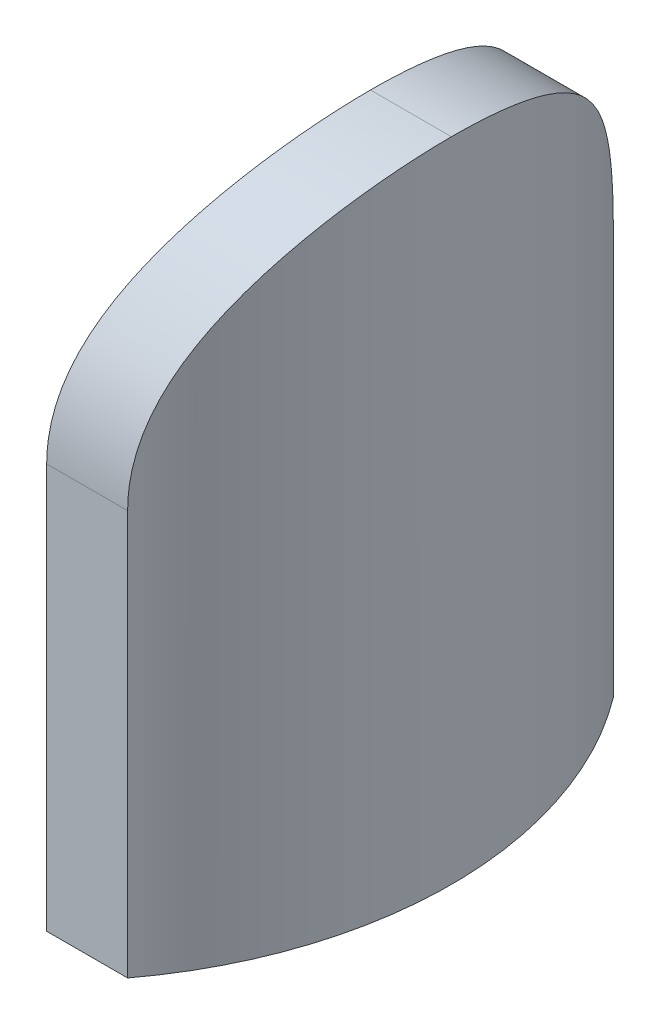
ISO-10303-21;
HEADER;
FILE_DESCRIPTION(('STEP AP214'),'2;1');
FILE_NAME('part.step','',(''),(''),'','','');
FILE_SCHEMA(('AUTOMOTIVE_DESIGN { 1 0 10303 214 1 1 1 1 }'));
ENDSEC;
DATA;
#1=APPLICATION_CONTEXT('core data for automotive mechanical design processes');
#2=APPLICATION_PROTOCOL_DEFINITION('international standard','automotive_design',2000,#1);
#3=PRODUCT_CONTEXT('',#1,'mechanical');
#4=PRODUCT('Part','Part','',(#3));
#5=PRODUCT_RELATED_PRODUCT_CATEGORY('part','',(#4));
#6=PRODUCT_DEFINITION_FORMATION('','',#4);
#7=PRODUCT_DEFINITION_CONTEXT('part definition',#1,'design');
#8=PRODUCT_DEFINITION('design','',#6,#7);
#9=PRODUCT_DEFINITION_SHAPE('','',#8);
#10=(LENGTH_UNIT() NAMED_UNIT(*) SI_UNIT(.MILLI.,.METRE.));
#11=(NAMED_UNIT(*) PLANE_ANGLE_UNIT() SI_UNIT($,.RADIAN.));
#12=(NAMED_UNIT(*) SI_UNIT($,.STERADIAN.) SOLID_ANGLE_UNIT());
#13=UNCERTAINTY_MEASURE_WITH_UNIT(LENGTH_MEASURE(1.E-05),#10,'distance_accuracy_value','');
#14=(GEOMETRIC_REPRESENTATION_CONTEXT(3) GLOBAL_UNCERTAINTY_ASSIGNED_CONTEXT((#13)) GLOBAL_UNIT_ASSIGNED_CONTEXT((#10,
#11,#12)) REPRESENTATION_CONTEXT('',''));
#15=CARTESIAN_POINT('',(0.,0.,0.));
#16=DIRECTION('',(0.,0.,1.));
#17=DIRECTION('',(1.,0.,0.));
#18=AXIS2_PLACEMENT_3D('',#15,#16,#17);
#19=CARTESIAN_POINT('',(0.,0.,0.));
#20=DIRECTION('',(0.,-1.,0.));
#21=DIRECTION('',(0.,0.,-1.));
#22=AXIS2_PLACEMENT_3D('',#19,#20,#21);
#23=PLANE('',#22);
#24=CARTESIAN_POINT('',(-20.,0.,-15.));
#25=DIRECTION('',(0.,-1.,0.));
#26=DIRECTION('',(0.,0.,-1.));
#27=AXIS2_PLACEMENT_3D('',#24,#25,#26);
#28=CIRCLE('',#27,26.);
#29=CARTESIAN_POINT('',(1.90890230020664,0.,-1.));
#30=VERTEX_POINT('',#29);
#31=CARTESIAN_POINT('',(1.90890230020664,0.,-29.));
#32=VERTEX_POINT('',#31);
#33=EDGE_CURVE('E288',#30,#32,#28,.F.);
#34=ORIENTED_EDGE('',*,*,#33,.F.);
#35=DIRECTION('',(1.,0.,0.));
#36=VECTOR('',#35,1.);
#37=CARTESIAN_POINT('',(0.,0.,-1.));
#38=LINE('',#37,#36);
#39=CARTESIAN_POINT('',(4.49358868961793,0.,-1.));
#40=VERTEX_POINT('',#39);
#41=EDGE_CURVE('E173',#30,#40,#38,.T.);
#42=ORIENTED_EDGE('',*,*,#41,.T.);
#43=CARTESIAN_POINT('',(-15.,0.,-15.));
#44=DIRECTION('',(0.,-1.,0.));
#45=DIRECTION('',(0.,0.,-1.));
#46=AXIS2_PLACEMENT_3D('',#43,#44,#45);
#47=CIRCLE('',#46,24.);
#48=CARTESIAN_POINT('',(4.49358868961793,0.,-29.));
#49=VERTEX_POINT('',#48);
#50=EDGE_CURVE('E157',#40,#49,#47,.F.);
#51=ORIENTED_EDGE('',*,*,#50,.T.);
#52=DIRECTION('',(-1.,0.,0.));
#53=VECTOR('',#52,1.);
#54=CARTESIAN_POINT('',(0.,0.,-29.));
#55=LINE('',#54,#53);
#56=EDGE_CURVE('E86',#49,#32,#55,.T.);
#57=ORIENTED_EDGE('',*,*,#56,.T.);
#58=EDGE_LOOP('',(#34,#42,#51,#57));
#59=FACE_BOUND('',#58,.T.);
#60=DIRECTION('',(1.,0.,0.));
#61=VECTOR('',#60,1.);
#62=CARTESIAN_POINT('',(0.,0.,0.));
#63=LINE('',#62,#61);
#64=CARTESIAN_POINT('',(0.,0.,0.));
#65=VERTEX_POINT('',#64);
#66=CARTESIAN_POINT('',(5.,0.,0.));
#67=VERTEX_POINT('',#66);
#68=EDGE_CURVE('E239',#65,#67,#63,.T.);
#69=ORIENTED_EDGE('',*,*,#68,.F.);
#70=CARTESIAN_POINT('',(-20.,0.,-15.));
#71=DIRECTION('',(0.,-1.,0.));
#72=DIRECTION('',(0.,0.,-1.));
#73=AXIS2_PLACEMENT_3D('',#70,#71,#72);
#74=CIRCLE('',#73,25.);
#75=CARTESIAN_POINT('',(0.,0.,-30.));
#76=VERTEX_POINT('',#75);
#77=EDGE_CURVE('E168',#65,#76,#74,.F.);
#78=ORIENTED_EDGE('',*,*,#77,.T.);
#79=DIRECTION('',(-1.,0.,0.));
#80=VECTOR('',#79,1.);
#81=CARTESIAN_POINT('',(0.,0.,-30.));
#82=LINE('',#81,#80);
#83=CARTESIAN_POINT('',(5.,0.,-30.));
#84=VERTEX_POINT('',#83);
#85=EDGE_CURVE('E242',#84,#76,#82,.T.);
#86=ORIENTED_EDGE('',*,*,#85,.F.);
#87=CARTESIAN_POINT('',(-15.,0.,-15.));
#88=DIRECTION('',(0.,-1.,0.));
#89=DIRECTION('',(0.,0.,-1.));
#90=AXIS2_PLACEMENT_3D('',#87,#88,#89);
#91=CIRCLE('',#90,25.);
#92=EDGE_CURVE('E232',#67,#84,#91,.F.);
#93=ORIENTED_EDGE('',*,*,#92,.F.);
#94=EDGE_LOOP('',(#69,#78,#86,#93));
#95=FACE_BOUND('',#94,.T.);
#96=ADVANCED_FACE('F65',(#59,#95),#23,.T.);
#97=CARTESIAN_POINT('',(0.,25.,-15.));
#98=DIRECTION('',(1.,0.,0.));
#99=DIRECTION('',(0.,0.,-1.));
#100=AXIS2_PLACEMENT_3D('',#97,#98,#99);
#101=CYLINDRICAL_SURFACE('',#100,15.);
#102=DIRECTION('',(1.,0.,0.));
#103=VECTOR('',#102,1.);
#104=CARTESIAN_POINT('',(0.,40.,-15.));
#105=LINE('',#104,#103);
#106=CARTESIAN_POINT('',(5.,40.,-15.));
#107=VERTEX_POINT('',#106);
#108=CARTESIAN_POINT('',(10.,40.,-15.));
#109=VERTEX_POINT('',#108);
#110=EDGE_CURVE('E238',#107,#109,#105,.T.);
#111=ORIENTED_EDGE('',*,*,#110,.F.);
#112=CARTESIAN_POINT('',(5.,40.,-15.));
#113=CARTESIAN_POINT('',(5.00000255303904,40.0000014448195,-14.807139240783));
#114=CARTESIAN_POINT('',(4.99776756837185,39.9962796415475,-14.6143052551226));
#115=CARTESIAN_POINT('',(4.988852043241,39.9814144024335,-14.2290358472785));
#116=CARTESIAN_POINT('',(4.98217172131322,39.9702713314263,-14.0366004059684));
#117=CARTESIAN_POINT('',(4.95551970517856,39.9257686852686,-13.460662099342));
#118=CARTESIAN_POINT('',(4.92893687352655,39.8813355989165,-13.0782439427544));
#119=CARTESIAN_POINT('',(4.85900230313622,39.7638813460724,-12.3216347662555));
#120=CARTESIAN_POINT('',(4.81574386063857,39.6910192065472,-11.9474100033291));
#121=CARTESIAN_POINT('',(4.71349974307436,39.5176434117936,-11.2075897739409));
#122=CARTESIAN_POINT('',(4.65451276236398,39.4171274609689,-10.8419950266103));
#123=CARTESIAN_POINT('',(4.52230108499333,39.1898475665261,-10.1224651374941));
#124=CARTESIAN_POINT('',(4.44910161891259,39.063130111363,-9.76851061482231));
#125=CARTESIAN_POINT('',(4.28999750738376,38.7846666352483,-9.07352288744276));
#126=CARTESIAN_POINT('',(4.20409146899427,38.6329178700616,-8.73249110452877));
#127=CARTESIAN_POINT('',(4.0212742686169,38.305640007835,-8.06470239034774));
#128=CARTESIAN_POINT('',(3.92435259189221,38.1300881587129,-7.73795951716173));
#129=CARTESIAN_POINT('',(3.72147921691018,37.7566901026436,-7.10042080520032));
#130=CARTESIAN_POINT('',(3.61552711660638,37.5588429029513,-6.78962567742763));
#131=CARTESIAN_POINT('',(3.38830666152485,37.1263869185156,-6.16220140314858));
#132=CARTESIAN_POINT('',(3.26648597010581,36.8901295534895,-5.84690854827094));
#133=CARTESIAN_POINT('',(3.01728103693652,36.394781620118,-5.23714813290431));
#134=CARTESIAN_POINT('',(2.88989644135278,36.1356895985454,-4.94268190000132));
#135=CARTESIAN_POINT('',(2.63207385801871,35.5956191527101,-4.37519489621732));
#136=CARTESIAN_POINT('',(2.50163211587833,35.314612711962,-4.10220250420785));
#137=CARTESIAN_POINT('',(2.24065579414008,34.7321408262498,-3.57902350212612));
#138=CARTESIAN_POINT('',(2.11012120958845,34.4306741935122,-3.32883821805178));
#139=CARTESIAN_POINT('',(1.83593170500332,33.7697872838141,-2.82277501999216));
#140=CARTESIAN_POINT('',(1.69265088655934,33.4078108189097,-2.57002026883669));
#141=CARTESIAN_POINT('',(1.41414876665926,32.6606731273394,-2.09613233937664));
#142=CARTESIAN_POINT('',(1.27892865335207,32.2755084994701,-1.87500381609344));
#143=CARTESIAN_POINT('',(1.02174499046558,31.4848327842958,-1.46692030218351));
#144=CARTESIAN_POINT('',(0.89974191364931,31.0793879809236,-1.2798622082106));
#145=CARTESIAN_POINT('',(0.673518450642857,30.249159031973,-0.941296515503435));
#146=CARTESIAN_POINT('',(0.569293042369875,29.8243803911848,-0.789778872256041));
#147=CARTESIAN_POINT('',(0.401561432612984,29.0422772379172,-0.550317643520221));
#148=CARTESIAN_POINT('',(0.33407841401163,28.687827799326,-0.455744488750455));
#149=CARTESIAN_POINT('',(0.216271402916402,27.9703153595226,-0.292432837999522));
#150=CARTESIAN_POINT('',(0.165941575790319,27.607255332224,-0.223685556571274));
#151=CARTESIAN_POINT('',(0.0840749466616391,26.8720120020111,-0.112596350530339));
#152=CARTESIAN_POINT('',(0.0526872706083913,26.499779718572,-0.0704638380633984));
#153=CARTESIAN_POINT('',(0.02115131074478,25.9388827067956,-0.0282343160358451));
#154=CARTESIAN_POINT('',(0.0132301653683997,25.7513674516214,-0.0176526373636945));
#155=CARTESIAN_POINT('',(0.00265113917673493,25.3759109371958,-0.00353412003424032));
#156=CARTESIAN_POINT('',(-6.37371700307303E-06,25.1879696490842,2.22616294262261E-06));
#157=CARTESIAN_POINT('',(0.,25.,0.));
#158=B_SPLINE_CURVE_WITH_KNOTS('',3,(#112,#113,#114,#115,#116,#117,#118,#119,#120,#121,#122,
#123,#124,#125,#126,#127,#128,#129,#130,#131,#132,#133,#134,#135,#136,#137,#138,#139,#140,#141,
#142,#143,#144,#145,#146,#147,#148,#149,#150,#151,#152,#153,#154,#155,#156,#157),.UNSPECIFIED.,
.F.,.F.,(4,2,2,2,2,2,2,2,2,2,2,2,2,2,2,2,2,2,2,2,2,2,4),(0.,0.578480406817589,1.15693237723428,
2.31298948606274,3.46267045241436,4.61244688481602,5.76020054792808,6.90808012541576,
8.05706473705736,9.20610052976803,10.4420323846505,11.6780429527176,12.9156604526634,
14.1533498614631,15.5441212655779,16.9350971652344,18.3217911237673,19.7080926986022,
20.8258194743536,21.94316567669,23.0691974026535,23.6329592205931,24.1967604434116),.UNSPECIFIED.);
#159=CARTESIAN_POINT('',(0.,25.,0.));
#160=VERTEX_POINT('',#159);
#161=EDGE_CURVE('E94',#107,#160,#158,.T.);
#162=ORIENTED_EDGE('',*,*,#161,.T.);
#163=DIRECTION('',(1.,0.,0.));
#164=VECTOR('',#163,1.);
#165=CARTESIAN_POINT('',(0.,25.,0.));
#166=LINE('',#165,#164);
#167=CARTESIAN_POINT('',(5.,25.,0.));
#168=VERTEX_POINT('',#167);
#169=EDGE_CURVE('E253',#168,#160,#166,.F.);
#170=ORIENTED_EDGE('',*,*,#169,.F.);
#171=CARTESIAN_POINT('',(10.,40.,-15.));
#172=CARTESIAN_POINT('',(10.000002553039,40.0000014448195,-14.807139240783));
#173=CARTESIAN_POINT('',(9.99776756837185,39.9962796415475,-14.6143052551226));
#174=CARTESIAN_POINT('',(9.988852043241,39.9814144024335,-14.2290358472785));
#175=CARTESIAN_POINT('',(9.98217172131322,39.9702713314263,-14.0366004059684));
#176=CARTESIAN_POINT('',(9.95551970517857,39.9257686852686,-13.460662099342));
#177=CARTESIAN_POINT('',(9.92893687352655,39.8813355989165,-13.0782439427544));
#178=CARTESIAN_POINT('',(9.85900230313622,39.7638813460724,-12.3216347662555));
#179=CARTESIAN_POINT('',(9.81574386063857,39.6910192065472,-11.9474100033291));
#180=CARTESIAN_POINT('',(9.71349974307437,39.5176434117936,-11.2075897739409));
#181=CARTESIAN_POINT('',(9.65451276236398,39.4171274609689,-10.8419950266103));
#182=CARTESIAN_POINT('',(9.52230108499333,39.1898475665261,-10.1224651374941));
#183=CARTESIAN_POINT('',(9.44910161891259,39.063130111363,-9.7685106148223));
#184=CARTESIAN_POINT('',(9.28999750738376,38.7846666352483,-9.07352288744276));
#185=CARTESIAN_POINT('',(9.20409146899427,38.6329178700616,-8.73249110452877));
#186=CARTESIAN_POINT('',(9.0212742686169,38.305640007835,-8.06470239034773));
#187=CARTESIAN_POINT('',(8.92435259189221,38.1300881587129,-7.73795951716173));
#188=CARTESIAN_POINT('',(8.72147921691018,37.7566901026436,-7.10042080520031));
#189=CARTESIAN_POINT('',(8.61552711660639,37.5588429029513,-6.78962567742763));
#190=CARTESIAN_POINT('',(8.38830666152485,37.1263869185156,-6.16220140314858));
#191=CARTESIAN_POINT('',(8.26648597010581,36.8901295534895,-5.84690854827093));
#192=CARTESIAN_POINT('',(8.01728103693652,36.394781620118,-5.23714813290431));
#193=CARTESIAN_POINT('',(7.88989644135278,36.1356895985454,-4.94268190000132));
#194=CARTESIAN_POINT('',(7.63207385801871,35.5956191527101,-4.37519489621732));
#195=CARTESIAN_POINT('',(7.50163211587833,35.314612711962,-4.10220250420785));
#196=CARTESIAN_POINT('',(7.24065579414007,34.7321408262498,-3.57902350212611));
#197=CARTESIAN_POINT('',(7.11012120958845,34.4306741935122,-3.32883821805177));
#198=CARTESIAN_POINT('',(6.83593170500332,33.7697872838141,-2.82277501999216));
#199=CARTESIAN_POINT('',(6.69265088655934,33.4078108189097,-2.57002026883669));
#200=CARTESIAN_POINT('',(6.41414876665926,32.6606731273394,-2.09613233937664));
#201=CARTESIAN_POINT('',(6.27892865335207,32.2755084994701,-1.87500381609344));
#202=CARTESIAN_POINT('',(6.02174499046558,31.4848327842958,-1.46692030218351));
#203=CARTESIAN_POINT('',(5.89974191364931,31.0793879809236,-1.2798622082106));
#204=CARTESIAN_POINT('',(5.67351845064286,30.249159031973,-0.941296515503438));
#205=CARTESIAN_POINT('',(5.56929304236988,29.8243803911848,-0.789778872256043));
#206=CARTESIAN_POINT('',(5.40156143261299,29.0422772379173,-0.550317643520223));
#207=CARTESIAN_POINT('',(5.33407841401163,28.687827799326,-0.455744488750456));
#208=CARTESIAN_POINT('',(5.2162714029164,27.9703153595226,-0.292432837999522));
#209=CARTESIAN_POINT('',(5.16594157579032,27.607255332224,-0.223685556571274));
#210=CARTESIAN_POINT('',(5.08407494666164,26.8720120020111,-0.112596350530339));
#211=CARTESIAN_POINT('',(5.05268727060839,26.4997797185719,-0.0704638380634002));
#212=CARTESIAN_POINT('',(5.02115131074478,25.9388827067956,-0.0282343160358455));
#213=CARTESIAN_POINT('',(5.0132301653684,25.7513674516214,-0.0176526373636939));
#214=CARTESIAN_POINT('',(5.00265113917674,25.3759109371958,-0.00353412003423857));
#215=CARTESIAN_POINT('',(4.999993626283,25.1879696490842,2.22616294457471E-06));
#216=CARTESIAN_POINT('',(5.,25.,0.));
#217=B_SPLINE_CURVE_WITH_KNOTS('',3,(#171,#172,#173,#174,#175,#176,#177,#178,#179,#180,#181,
#182,#183,#184,#185,#186,#187,#188,#189,#190,#191,#192,#193,#194,#195,#196,#197,#198,#199,#200,
#201,#202,#203,#204,#205,#206,#207,#208,#209,#210,#211,#212,#213,#214,#215,#216),.UNSPECIFIED.,
.F.,.F.,(4,2,2,2,2,2,2,2,2,2,2,2,2,2,2,2,2,2,2,2,2,2,4),(0.,0.578480406817588,1.15693237723428,
2.31298948606274,3.46267045241436,4.61244688481602,5.76020054792809,6.90808012541577,
8.05706473705736,9.20610052976803,10.4420323846505,11.6780429527176,12.9156604526634,
14.1533498614631,15.5441212655779,16.9350971652344,18.3217911237673,19.7080926986022,
20.8258194743536,21.94316567669,23.0691974026535,23.6329592205931,24.1967604434116),.UNSPECIFIED.);
#218=EDGE_CURVE('E256',#109,#168,#217,.T.);
#219=ORIENTED_EDGE('',*,*,#218,.F.);
#220=EDGE_LOOP('',(#111,#162,#170,#219));
#221=FACE_BOUND('',#220,.T.);
#222=ADVANCED_FACE('F67',(#221),#101,.T.);
#223=CARTESIAN_POINT('',(0.,25.,-15.));
#224=DIRECTION('',(-1.,0.,0.));
#225=DIRECTION('',(0.,0.,1.));
#226=AXIS2_PLACEMENT_3D('',#223,#224,#225);
#227=CYLINDRICAL_SURFACE('',#226,15.);
#228=DIRECTION('',(-1.,0.,0.));
#229=VECTOR('',#228,1.);
#230=CARTESIAN_POINT('',(0.,25.,-30.));
#231=LINE('',#230,#229);
#232=CARTESIAN_POINT('',(0.,25.,-30.));
#233=VERTEX_POINT('',#232);
#234=CARTESIAN_POINT('',(5.,25.,-30.));
#235=VERTEX_POINT('',#234);
#236=EDGE_CURVE('E250',#233,#235,#231,.F.);
#237=ORIENTED_EDGE('',*,*,#236,.F.);
#238=CARTESIAN_POINT('',(0.,25.,-30.));
#239=CARTESIAN_POINT('',(-6.57753376248257E-06,25.1896865035366,-30.0000022743161));
#240=CARTESIAN_POINT('',(0.00269982421293849,25.3793436960936,-29.9964009974288));
#241=CARTESIAN_POINT('',(0.0134725603385227,25.7582204977784,-29.9820237061057));
#242=CARTESIAN_POINT('',(0.0215385194002158,25.9474401366162,-29.9712481940648));
#243=CARTESIAN_POINT('',(0.0536511718163341,26.5134540045913,-29.9282430537791));
#244=CARTESIAN_POINT('',(0.0856129609716568,26.8890672637699,-29.8853346491875));
#245=CARTESIAN_POINT('',(0.168934456317175,27.6307329698469,-29.7722345963939));
#246=CARTESIAN_POINT('',(0.220135266174966,27.996838158724,-29.702266302786));
#247=CARTESIAN_POINT('',(0.339923978383524,28.7201854334441,-29.5360919628884));
#248=CARTESIAN_POINT('',(0.408515372145089,29.0774257237005,-29.4398806476388));
#249=CARTESIAN_POINT('',(0.56034067938523,29.7796148367526,-29.2228623203275));
#250=CARTESIAN_POINT('',(0.643519177902377,30.1246044373713,-29.1021481283068));
#251=CARTESIAN_POINT('',(0.822027585333518,30.8020404435561,-28.8372225095493));
#252=CARTESIAN_POINT('',(0.917357127039059,31.1344872277768,-28.6930117928483));
#253=CARTESIAN_POINT('',(1.21807161081099,32.1128161277781,-28.2261198333804));
#254=CARTESIAN_POINT('',(1.43792856025008,32.7385807361989,-27.8695251974988));
#255=CARTESIAN_POINT('',(1.79475767332603,33.6663887442314,-27.2496883781993));
#256=CARTESIAN_POINT('',(1.92575016586086,33.9899579343779,-27.0141778499218));
#257=CARTESIAN_POINT('',(2.19013811232851,34.6168042386678,-26.518531331475));
#258=CARTESIAN_POINT('',(2.32353370891207,34.9200801431097,-26.2583938755));
#259=CARTESIAN_POINT('',(2.58962648920578,35.5051973095016,-25.714499449163));
#260=CARTESIAN_POINT('',(2.72232337080925,35.7870299114338,-25.4307330319717));
#261=CARTESIAN_POINT('',(2.98403377306225,36.3279216679954,-24.8406486830948));
#262=CARTESIAN_POINT('',(3.11304713179002,36.586979822534,-24.534329762149));
#263=CARTESIAN_POINT('',(3.3782867343208,37.1078438053847,-23.8655955368131));
#264=CARTESIAN_POINT('',(3.51376465384474,37.3668668390195,-23.5007059824003));
#265=CARTESIAN_POINT('',(3.77300478460932,37.852938154771,-22.7461840606684));
#266=CARTESIAN_POINT('',(3.8967656101572,38.0799826565713,-22.3565487759389));
#267=CARTESIAN_POINT('',(4.12879030509004,38.4992201358522,-21.5555315766102));
#268=CARTESIAN_POINT('',(4.23708342412968,38.6914790820964,-21.1441927772118));
#269=CARTESIAN_POINT('',(4.43514289133291,39.0391107870733,-20.3019587845141));
#270=CARTESIAN_POINT('',(4.52491407838513,39.1944931814707,-19.8710687349923));
#271=CARTESIAN_POINT('',(4.66773110169533,39.4396964515662,-19.0782921604656));
#272=CARTESIAN_POINT('',(4.72452212343595,39.5363857935425,-18.7191901707639));
#273=CARTESIAN_POINT('',(4.82291167656534,39.7031114004504,-17.9928738830367));
#274=CARTESIAN_POINT('',(4.86451385234193,39.7731540591149,-17.6256615534476));
#275=CARTESIAN_POINT('',(4.93173588188162,39.8860180091936,-16.8836083821668));
#276=CARTESIAN_POINT('',(4.9572719734325,39.9286966571515,-16.5087379112008));
#277=CARTESIAN_POINT('',(4.98287447992087,39.9714437549773,-15.9442286031424));
#278=CARTESIAN_POINT('',(4.98929173380262,39.9821476632192,-15.7556114128665));
#279=CARTESIAN_POINT('',(4.99785576438541,39.9964266024899,-15.3780044812362));
#280=CARTESIAN_POINT('',(5.0000023995924,40.0000013973172,-15.1890147277456));
#281=CARTESIAN_POINT('',(5.,40.,-15.));
#282=B_SPLINE_CURVE_WITH_KNOTS('',3,(#238,#239,#240,#241,#242,#243,#244,#245,#246,#247,#248,
#249,#250,#251,#252,#253,#254,#255,#256,#257,#258,#259,#260,#261,#262,#263,#264,#265,#266,#267,
#268,#269,#270,#271,#272,#273,#274,#275,#276,#277,#278,#279,#280,#281),.UNSPECIFIED.,.F.,.F.,(4,
2,2,2,2,2,2,2,2,2,2,2,2,2,2,2,2,2,2,2,2,4),(0.,0.568948492456896,1.13785714698768,
2.27428783065659,3.40153190345249,4.52900246622277,5.65227916641425,6.77552192886538,
9.02553188815566,10.2878887828921,11.5503208609743,12.8132601036942,14.0762547779835,
15.4770197621441,16.8779501978765,18.2761953486606,19.6740747414998,20.8014183691002,
21.9284913256019,23.0613927344471,23.6283226791157,24.195271406983),.UNSPECIFIED.);
#283=EDGE_CURVE('E12',#233,#107,#282,.T.);
#284=ORIENTED_EDGE('',*,*,#283,.T.);
#285=ORIENTED_EDGE('',*,*,#110,.T.);
#286=CARTESIAN_POINT('',(5.,25.,-30.));
#287=CARTESIAN_POINT('',(4.99999342246624,25.1896865035367,-30.0000022743161));
#288=CARTESIAN_POINT('',(5.00269982421294,25.3793436960936,-29.9964009974288));
#289=CARTESIAN_POINT('',(5.01347256033852,25.7582204977785,-29.9820237061058));
#290=CARTESIAN_POINT('',(5.02153851940021,25.9474401366162,-29.9712481940648));
#291=CARTESIAN_POINT('',(5.05365117181633,26.5134540045913,-29.9282430537791));
#292=CARTESIAN_POINT('',(5.08561296097165,26.8890672637699,-29.8853346491875));
#293=CARTESIAN_POINT('',(5.16893445631718,27.6307329698469,-29.7722345963939));
#294=CARTESIAN_POINT('',(5.22013526617497,27.996838158724,-29.702266302786));
#295=CARTESIAN_POINT('',(5.33992397838353,28.7201854334441,-29.5360919628884));
#296=CARTESIAN_POINT('',(5.40851537214509,29.0774257237005,-29.4398806476388));
#297=CARTESIAN_POINT('',(5.56034067938523,29.7796148367526,-29.2228623203274));
#298=CARTESIAN_POINT('',(5.64351917790238,30.1246044373713,-29.1021481283068));
#299=CARTESIAN_POINT('',(5.82202758533353,30.8020404435561,-28.8372225095493));
#300=CARTESIAN_POINT('',(5.91735712703906,31.1344872277768,-28.6930117928483));
#301=CARTESIAN_POINT('',(6.21807161081099,32.1128161277781,-28.2261198333804));
#302=CARTESIAN_POINT('',(6.43792856025008,32.7385807361989,-27.8695251974988));
#303=CARTESIAN_POINT('',(6.79475767332603,33.6663887442314,-27.2496883781993));
#304=CARTESIAN_POINT('',(6.92575016586086,33.9899579343779,-27.0141778499218));
#305=CARTESIAN_POINT('',(7.19013811232852,34.6168042386678,-26.518531331475));
#306=CARTESIAN_POINT('',(7.32353370891207,34.9200801431097,-26.2583938755));
#307=CARTESIAN_POINT('',(7.58962648920579,35.5051973095016,-25.714499449163));
#308=CARTESIAN_POINT('',(7.72232337080926,35.7870299114338,-25.4307330319717));
#309=CARTESIAN_POINT('',(7.98403377306225,36.3279216679954,-24.8406486830948));
#310=CARTESIAN_POINT('',(8.11304713179003,36.5869798225341,-24.534329762149));
#311=CARTESIAN_POINT('',(8.3782867343208,37.1078438053847,-23.8655955368131));
#312=CARTESIAN_POINT('',(8.51376465384475,37.3668668390195,-23.5007059824003));
#313=CARTESIAN_POINT('',(8.77300478460933,37.852938154771,-22.7461840606684));
#314=CARTESIAN_POINT('',(8.89676561015721,38.0799826565713,-22.3565487759389));
#315=CARTESIAN_POINT('',(9.12879030509004,38.4992201358522,-21.5555315766102));
#316=CARTESIAN_POINT('',(9.23708342412968,38.6914790820964,-21.1441927772118));
#317=CARTESIAN_POINT('',(9.43514289133291,39.0391107870733,-20.3019587845141));
#318=CARTESIAN_POINT('',(9.52491407838513,39.1944931814707,-19.8710687349923));
#319=CARTESIAN_POINT('',(9.66773110169533,39.4396964515662,-19.0782921604656));
#320=CARTESIAN_POINT('',(9.72452212343594,39.5363857935425,-18.7191901707639));
#321=CARTESIAN_POINT('',(9.82291167656534,39.7031114004504,-17.9928738830367));
#322=CARTESIAN_POINT('',(9.86451385234193,39.773154059115,-17.6256615534476));
#323=CARTESIAN_POINT('',(9.93173588188162,39.8860180091936,-16.8836083821668));
#324=CARTESIAN_POINT('',(9.9572719734325,39.9286966571515,-16.5087379112008));
#325=CARTESIAN_POINT('',(9.98287447992088,39.9714437549773,-15.9442286031424));
#326=CARTESIAN_POINT('',(9.98929173380262,39.9821476632192,-15.7556114128665));
#327=CARTESIAN_POINT('',(9.99785576438541,39.9964266024899,-15.3780044812362));
#328=CARTESIAN_POINT('',(10.0000023995924,40.0000013973172,-15.1890147277456));
#329=CARTESIAN_POINT('',(10.,40.,-15.));
#330=B_SPLINE_CURVE_WITH_KNOTS('',3,(#286,#287,#288,#289,#290,#291,#292,#293,#294,#295,#296,
#297,#298,#299,#300,#301,#302,#303,#304,#305,#306,#307,#308,#309,#310,#311,#312,#313,#314,#315,
#316,#317,#318,#319,#320,#321,#322,#323,#324,#325,#326,#327,#328,#329),.UNSPECIFIED.,.F.,.F.,(4,
2,2,2,2,2,2,2,2,2,2,2,2,2,2,2,2,2,2,2,2,4),(0.,0.568948492456899,1.13785714698769,
2.27428783065659,3.4015319034525,4.52900246622277,5.65227916641426,6.77552192886538,
9.02553188815566,10.2878887828921,11.5503208609743,12.8132601036942,14.0762547779835,
15.4770197621441,16.8779501978765,18.2761953486606,19.6740747414998,20.8014183691002,
21.9284913256019,23.0613927344472,23.6283226791157,24.195271406983),.UNSPECIFIED.);
#331=EDGE_CURVE('E79',#235,#109,#330,.T.);
#332=ORIENTED_EDGE('',*,*,#331,.F.);
#333=EDGE_LOOP('',(#237,#284,#285,#332));
#334=FACE_BOUND('',#333,.T.);
#335=ADVANCED_FACE('F267',(#334),#227,.T.);
#336=CARTESIAN_POINT('',(0.,40.,0.));
#337=DIRECTION('',(0.,0.,-1.));
#338=DIRECTION('',(-1.,0.,0.));
#339=AXIS2_PLACEMENT_3D('',#336,#337,#338);
#340=PLANE('',#339);
#341=ORIENTED_EDGE('',*,*,#68,.T.);
#342=DIRECTION('',(0.,-1.,0.));
#343=VECTOR('',#342,1.);
#344=CARTESIAN_POINT('',(5.,40.,0.));
#345=LINE('',#344,#343);
#346=EDGE_CURVE('E236',#168,#67,#345,.T.);
#347=ORIENTED_EDGE('',*,*,#346,.F.);
#348=ORIENTED_EDGE('',*,*,#169,.T.);
#349=DIRECTION('',(0.,-1.,0.));
#350=VECTOR('',#349,1.);
#351=CARTESIAN_POINT('',(0.,40.,0.));
#352=LINE('',#351,#350);
#353=EDGE_CURVE('E247',#160,#65,#352,.T.);
#354=ORIENTED_EDGE('',*,*,#353,.T.);
#355=EDGE_LOOP('',(#341,#347,#348,#354));
#356=FACE_BOUND('',#355,.T.);
#357=ADVANCED_FACE('F271',(#356),#340,.F.);
#358=CARTESIAN_POINT('',(0.,40.,-30.));
#359=DIRECTION('',(0.,0.,1.));
#360=DIRECTION('',(1.,0.,0.));
#361=AXIS2_PLACEMENT_3D('',#358,#359,#360);
#362=PLANE('',#361);
#363=ORIENTED_EDGE('',*,*,#236,.T.);
#364=DIRECTION('',(0.,-1.,0.));
#365=VECTOR('',#364,1.);
#366=CARTESIAN_POINT('',(5.,40.,-30.));
#367=LINE('',#366,#365);
#368=EDGE_CURVE('E233',#235,#84,#367,.T.);
#369=ORIENTED_EDGE('',*,*,#368,.T.);
#370=ORIENTED_EDGE('',*,*,#85,.T.);
#371=DIRECTION('',(0.,-1.,0.));
#372=VECTOR('',#371,1.);
#373=CARTESIAN_POINT('',(0.,40.,-30.));
#374=LINE('',#373,#372);
#375=EDGE_CURVE('E245',#233,#76,#374,.T.);
#376=ORIENTED_EDGE('',*,*,#375,.F.);
#377=EDGE_LOOP('',(#363,#369,#370,#376));
#378=FACE_BOUND('',#377,.T.);
#379=ADVANCED_FACE('F276',(#378),#362,.F.);
#380=CARTESIAN_POINT('',(-15.,40.,-15.));
#381=DIRECTION('',(0.,-1.,0.));
#382=DIRECTION('',(0.,0.,-1.));
#383=AXIS2_PLACEMENT_3D('',#380,#381,#382);
#384=CYLINDRICAL_SURFACE('',#383,25.);
#385=ORIENTED_EDGE('',*,*,#218,.T.);
#386=ORIENTED_EDGE('',*,*,#346,.T.);
#387=ORIENTED_EDGE('',*,*,#92,.T.);
#388=ORIENTED_EDGE('',*,*,#368,.F.);
#389=ORIENTED_EDGE('',*,*,#331,.T.);
#390=EDGE_LOOP('',(#385,#386,#387,#388,#389));
#391=FACE_BOUND('',#390,.T.);
#392=ADVANCED_FACE('F221',(#391),#384,.T.);
#393=CARTESIAN_POINT('',(-20.,40.,-15.));
#394=DIRECTION('',(0.,-1.,0.));
#395=DIRECTION('',(0.,0.,-1.));
#396=AXIS2_PLACEMENT_3D('',#393,#394,#395);
#397=CYLINDRICAL_SURFACE('',#396,25.);
#398=ORIENTED_EDGE('',*,*,#283,.F.);
#399=ORIENTED_EDGE('',*,*,#375,.T.);
#400=ORIENTED_EDGE('',*,*,#77,.F.);
#401=ORIENTED_EDGE('',*,*,#353,.F.);
#402=ORIENTED_EDGE('',*,*,#161,.F.);
#403=EDGE_LOOP('',(#398,#399,#400,#401,#402));
#404=FACE_BOUND('',#403,.T.);
#405=ADVANCED_FACE('F217',(#404),#397,.F.);
#406=CARTESIAN_POINT('',(0.,25.,-15.));
#407=DIRECTION('',(1.,0.,0.));
#408=DIRECTION('',(0.,0.,-1.));
#409=AXIS2_PLACEMENT_3D('',#406,#407,#408);
#410=CYLINDRICAL_SURFACE('',#409,14.);
#411=DIRECTION('',(-1.,0.,0.));
#412=VECTOR('',#411,1.);
#413=CARTESIAN_POINT('',(0.,39.,-15.));
#414=LINE('',#413,#412);
#415=CARTESIAN_POINT('',(6.,39.,-15.));
#416=VERTEX_POINT('',#415);
#417=CARTESIAN_POINT('',(9.,39.,-15.));
#418=VERTEX_POINT('',#417);
#419=EDGE_CURVE('E152',#416,#418,#414,.F.);
#420=ORIENTED_EDGE('',*,*,#419,.T.);
#421=CARTESIAN_POINT('',(9.,39.,-15.));
#422=CARTESIAN_POINT('',(9.0000023601711,39.0000012915907,-14.8191579653562));
#423=CARTESIAN_POINT('',(8.99795535304547,38.9964952447467,-14.6383409002687));
#424=CARTESIAN_POINT('',(8.98978979884687,38.9824912408567,-14.2770784257725));
#425=CARTESIAN_POINT('',(8.98367144822753,38.9719936211735,-14.0966329988527));
#426=CARTESIAN_POINT('',(8.95926150397065,38.9300670214405,-13.5565678880551));
#427=CARTESIAN_POINT('',(8.93491493974511,38.8882042308599,-13.1979600644874));
#428=CARTESIAN_POINT('',(8.87086250914616,38.7775210934383,-12.4883819422402));
#429=CARTESIAN_POINT('',(8.83123986500559,38.7088467872784,-12.1373809613276));
#430=CARTESIAN_POINT('',(8.7375966871167,38.5454044576016,-11.4434454873618));
#431=CARTESIAN_POINT('',(8.68357500696875,38.4506343564111,-11.1005116389515));
#432=CARTESIAN_POINT('',(8.56250456532797,38.2362919370244,-10.4255302960244));
#433=CARTESIAN_POINT('',(8.49547782681262,38.1167615255234,-10.0934654913768));
#434=CARTESIAN_POINT('',(8.34982156959193,37.8540312143315,-9.44145331125506));
#435=CARTESIAN_POINT('',(8.27119087858747,37.710828922993,-9.12150716418724));
#436=CARTESIAN_POINT('',(8.10390706453901,37.4019110558914,-8.49502438444773));
#437=CARTESIAN_POINT('',(8.01524439453892,37.2361740041097,-8.18850091677096));
#438=CARTESIAN_POINT('',(7.82973516033385,36.8835720639283,-7.59046362110319));
#439=CARTESIAN_POINT('',(7.73288823788525,36.6967062505529,-7.29895045104732));
#440=CARTESIAN_POINT('',(7.52556749034285,36.2886797488974,-6.71128201032897));
#441=CARTESIAN_POINT('',(7.41461501434658,36.0660111288003,-6.41634249767842));
#442=CARTESIAN_POINT('',(7.1877837226908,35.5990292151825,-5.84595677949478));
#443=CARTESIAN_POINT('',(7.07190284919647,35.3547068331314,-5.57051884726221));
#444=CARTESIAN_POINT('',(6.83762446582463,34.8454562624004,-5.03996308098579));
#445=CARTESIAN_POINT('',(6.71922449671723,34.5805071968896,-4.78486637748279));
#446=CARTESIAN_POINT('',(6.48262921780917,34.0313214175044,-4.29624656728276));
#447=CARTESIAN_POINT('',(6.3644339153635,33.7470840246459,-4.06272422072618));
#448=CARTESIAN_POINT('',(6.1175052763506,33.1264492271153,-3.59257444104997));
#449=CARTESIAN_POINT('',(5.98912966241712,32.7878176201394,-3.35869788617142));
#450=CARTESIAN_POINT('',(5.7400503146482,32.0891599475028,-2.92051927572958));
#451=CARTESIAN_POINT('',(5.61934766287423,31.7291308781063,-2.71622138626112));
#452=CARTESIAN_POINT('',(5.39022916069902,30.9903578074368,-2.33954863877747));
#453=CARTESIAN_POINT('',(5.28177921497398,30.6116701725382,-2.16708430480005));
#454=CARTESIAN_POINT('',(5.0811833474463,29.8367147225015,-1.85540131925393));
#455=CARTESIAN_POINT('',(4.98903273822605,29.4404520028011,-1.71617310549074));
#456=CARTESIAN_POINT('',(4.84192643525202,28.7150195009596,-1.49771894018934));
#457=CARTESIAN_POINT('',(4.78321756885953,28.3885410645549,-1.41205067185494));
#458=CARTESIAN_POINT('',(4.68085307967457,27.7280651995113,-1.26420273595761));
#459=CARTESIAN_POINT('',(4.63719272189465,27.3940701712566,-1.20201567948233));
#460=CARTESIAN_POINT('',(4.56627191351882,26.7183066765667,-1.10162424670293));
#461=CARTESIAN_POINT('',(4.53912728174666,26.3765003672194,-1.06358916016785));
#462=CARTESIAN_POINT('',(4.51186488306054,25.86160676912,-1.02547533191102));
#463=CARTESIAN_POINT('',(4.50501978170727,25.6895097063334,-1.01592715623046));
#464=CARTESIAN_POINT('',(4.49587901157975,25.3449498991319,-1.00318841662824));
#465=CARTESIAN_POINT('',(4.49358361201846,25.1724871336823,-0.999998228918569));
#466=CARTESIAN_POINT('',(4.49358868961793,25.,-1.));
#467=B_SPLINE_CURVE_WITH_KNOTS('',3,(#421,#422,#423,#424,#425,#426,#427,#428,#429,#430,#431,
#432,#433,#434,#435,#436,#437,#438,#439,#440,#441,#442,#443,#444,#445,#446,#447,#448,#449,#450,
#451,#452,#453,#454,#455,#456,#457,#458,#459,#460,#461,#462,#463,#464,#465,#466),.UNSPECIFIED.,
.F.,.F.,(4,2,2,2,2,2,2,2,2,2,2,2,2,2,2,2,2,2,2,2,2,2,4),(0.,0.542431081318816,1.08483599073069,
2.16887069763672,3.24708131366176,4.32537779860586,5.40186396918161,6.47845896722829,
7.55608726606651,8.63376275963842,9.79014145827701,10.9470078324792,12.1050607180421,
13.2631543903319,14.5548772687692,15.8467819071207,17.1349981180506,18.4228432549766,
19.4495083951827,20.4758502014295,21.5093088224102,22.0266469072984,22.5440156029729),.UNSPECIFIED.);
#468=CARTESIAN_POINT('',(4.49358868961793,25.,-1.));
#469=VERTEX_POINT('',#468);
#470=EDGE_CURVE('E313',#418,#469,#467,.T.);
#471=ORIENTED_EDGE('',*,*,#470,.T.);
#472=DIRECTION('',(-1.,0.,0.));
#473=VECTOR('',#472,1.);
#474=CARTESIAN_POINT('',(0.,25.,-1.));
#475=LINE('',#474,#473);
#476=CARTESIAN_POINT('',(1.90890230020664,25.,-1.));
#477=VERTEX_POINT('',#476);
#478=EDGE_CURVE('E155',#469,#477,#475,.T.);
#479=ORIENTED_EDGE('',*,*,#478,.T.);
#480=CARTESIAN_POINT('',(6.,39.,-15.));
#481=CARTESIAN_POINT('',(6.00000228570547,39.0000011347429,-14.8169761162605));
#482=CARTESIAN_POINT('',(5.99806681256745,38.9964101944226,-14.6339771371709));
#483=CARTESIAN_POINT('',(5.99034645035231,38.9820657039292,-14.2683496850717));
#484=CARTESIAN_POINT('',(5.98456173659356,38.9713124799712,-14.0857211955677));
#485=CARTESIAN_POINT('',(5.96148287579911,38.9283602903118,-13.53909041692));
#486=CARTESIAN_POINT('',(5.9384639395558,38.885468745014,-13.1760980428592));
#487=CARTESIAN_POINT('',(5.87790045697692,38.7720007615185,-12.4576240122142));
#488=CARTESIAN_POINT('',(5.8404285095749,38.7015626681635,-12.1021140364797));
#489=CARTESIAN_POINT('',(5.75188664974711,38.5338367872344,-11.3991925174999));
#490=CARTESIAN_POINT('',(5.7008157827364,38.4365471147789,-11.051781544632));
#491=CARTESIAN_POINT('',(5.58638895904218,38.2163583602716,-10.3678554121969));
#492=CARTESIAN_POINT('',(5.52305109456137,38.0934969734421,-10.0313250478519));
#493=CARTESIAN_POINT('',(5.38548853477823,37.8232815144278,-9.37053394468256));
#494=CARTESIAN_POINT('',(5.31126281803797,37.6759251440864,-9.0462743606292));
#495=CARTESIAN_POINT('',(5.1534812449953,37.3578598945077,-8.41141298310896));
#496=CARTESIAN_POINT('',(5.06991682979334,37.1871295602916,-8.10082408818194));
#497=CARTESIAN_POINT('',(4.8952697815179,36.8236986866263,-7.4950054428698));
#498=CARTESIAN_POINT('',(4.80418683907082,36.6309972429816,-7.19977632532703));
#499=CARTESIAN_POINT('',(4.61014084967517,36.2114177696631,-6.6068726619301));
#500=CARTESIAN_POINT('',(4.50679049440205,35.983122299239,-6.31032774443429));
#501=CARTESIAN_POINT('',(4.29596380733185,35.5042886066487,-5.73720243703783));
#502=CARTESIAN_POINT('',(4.18848619327549,35.2537434396773,-5.46062832981858));
#503=CARTESIAN_POINT('',(3.97178765383167,34.7315505801484,-4.92845575522966));
#504=CARTESIAN_POINT('',(3.86256542899863,34.4598865136312,-4.67287388578382));
#505=CARTESIAN_POINT('',(3.64499752474982,33.8968162893633,-4.18400755980695));
#506=CARTESIAN_POINT('',(3.53665193290067,33.6054081859868,-3.95072530621129));
#507=CARTESIAN_POINT('',(3.31339217617105,32.9755248829223,-3.48660844042143));
#508=CARTESIAN_POINT('',(3.19882812686077,32.6352060985461,-3.25809940851605));
#509=CARTESIAN_POINT('',(2.97761664127159,31.9340784229292,-2.83090001494987));
#510=CARTESIAN_POINT('',(2.87096600295514,31.5732779247574,-2.63219755890654));
#511=CARTESIAN_POINT('',(2.66948012130248,30.8336650447738,-2.26665173242433));
#512=CARTESIAN_POINT('',(2.57462108999676,30.4548911286143,-2.09974384604701));
#513=CARTESIAN_POINT('',(2.40021729434535,29.6809900760977,-1.79922337229421));
#514=CARTESIAN_POINT('',(2.32066808393989,29.2858677280402,-1.66560111525331));
#515=CARTESIAN_POINT('',(2.19614305275756,28.5725248332657,-1.45960643061325));
#516=CARTESIAN_POINT('',(2.14741498053766,28.2569692699105,-1.38021782540061));
#517=CARTESIAN_POINT('',(2.06268661511317,27.61951632934,-1.24338874846919));
#518=CARTESIAN_POINT('',(2.02668290039819,27.2976206815544,-1.18594237626745));
#519=CARTESIAN_POINT('',(1.96838012261061,26.6477021525308,-1.09340774040678));
#520=CARTESIAN_POINT('',(1.94615013209104,26.3196567552592,-1.05843213147044));
#521=CARTESIAN_POINT('',(1.92384191285676,25.8258185572624,-1.02340096532608));
#522=CARTESIAN_POINT('',(1.9182452705611,25.6608373813399,-1.01462926673347));
#523=CARTESIAN_POINT('',(1.91077369326447,25.3305774295396,-1.00292808304653));
#524=CARTESIAN_POINT('',(1.90889890612558,25.1652986420994,-0.999998830061175));
#525=CARTESIAN_POINT('',(1.90890230020665,25.,-1.));
#526=B_SPLINE_CURVE_WITH_KNOTS('',3,(#480,#481,#482,#483,#484,#485,#486,#487,#488,#489,#490,
#491,#492,#493,#494,#495,#496,#497,#498,#499,#500,#501,#502,#503,#504,#505,#506,#507,#508,#509,
#510,#511,#512,#513,#514,#515,#516,#517,#518,#519,#520,#521,#522,#523,#524,#525),.UNSPECIFIED.,
.F.,.F.,(4,2,2,2,2,2,2,2,2,2,2,2,2,2,2,2,2,2,2,2,2,2,4),(0.,0.548976830445024,1.09792865878113,
2.19510061351068,3.28683166583674,4.3786393731403,5.46884890475967,6.55916077928311,
7.65048024699899,8.74184464291358,9.90538858054033,11.069296980665,12.2341169620864,
13.3990518951301,14.6743484379596,15.9491261056928,17.2212888424201,18.4930815764761,
19.4791649665631,20.4649830020986,21.455705538208,21.9515059621909,22.4473260829675),.UNSPECIFIED.);
#527=EDGE_CURVE('E148',#416,#477,#526,.T.);
#528=ORIENTED_EDGE('',*,*,#527,.F.);
#529=EDGE_LOOP('',(#420,#471,#479,#528));
#530=FACE_BOUND('',#529,.T.);
#531=ADVANCED_FACE('F150',(#530),#410,.F.);
#532=CARTESIAN_POINT('',(0.,25.,-15.));
#533=DIRECTION('',(-1.,0.,0.));
#534=DIRECTION('',(0.,0.,1.));
#535=AXIS2_PLACEMENT_3D('',#532,#533,#534);
#536=CYLINDRICAL_SURFACE('',#535,14.);
#537=DIRECTION('',(1.,0.,0.));
#538=VECTOR('',#537,1.);
#539=CARTESIAN_POINT('',(0.,25.,-29.));
#540=LINE('',#539,#538);
#541=CARTESIAN_POINT('',(1.90890230020664,25.,-29.));
#542=VERTEX_POINT('',#541);
#543=CARTESIAN_POINT('',(4.49358868961793,25.,-29.));
#544=VERTEX_POINT('',#543);
#545=EDGE_CURVE('E201',#542,#544,#540,.T.);
#546=ORIENTED_EDGE('',*,*,#545,.T.);
#547=CARTESIAN_POINT('',(4.49358868961793,25.,-29.));
#548=CARTESIAN_POINT('',(4.49358294593246,25.1781837337892,-29.0000019624681));
#549=CARTESIAN_POINT('',(4.49603287333743,25.356340368803,-28.9965974310225));
#550=CARTESIAN_POINT('',(4.50578613823419,25.7122503852286,-28.9830043138341));
#551=CARTESIAN_POINT('',(4.51308916360081,25.8900037918362,-28.972816164377));
#552=CARTESIAN_POINT('',(4.54216927598968,26.4217640694567,-28.932150071622));
#553=CARTESIAN_POINT('',(4.5711176631269,26.7746803187465,-28.8915703393243));
#554=CARTESIAN_POINT('',(4.64663680040809,27.4717617417437,-28.7845517855993));
#555=CARTESIAN_POINT('',(4.69307072103616,27.8159732676878,-28.7183136363974));
#556=CARTESIAN_POINT('',(4.80177509537797,28.4961457165207,-28.5609303767926));
#557=CARTESIAN_POINT('',(4.86404845099781,28.8321051151755,-28.4697807021786));
#558=CARTESIAN_POINT('',(5.00198666432649,29.4926024866304,-28.2640788122489));
#559=CARTESIAN_POINT('',(5.07760506368806,29.8171755456461,-28.1496075798293));
#560=CARTESIAN_POINT('',(5.23999885305807,30.4545908835006,-27.8982486548997));
#561=CARTESIAN_POINT('',(5.32677394778249,30.7674334725266,-27.7613615556438));
#562=CARTESIAN_POINT('',(5.50925016797058,31.3808530744843,-27.4659873833233));
#563=CARTESIAN_POINT('',(5.60496905810076,31.6814038952899,-27.3074570204809));
#564=CARTESIAN_POINT('',(5.80280877744821,32.2686522078605,-26.9700209111935));
#565=CARTESIAN_POINT('',(5.904930298427,32.5553481967572,-26.7911129613749));
#566=CARTESIAN_POINT('',(6.12516351850294,33.1459148877562,-26.3923253812228));
#567=CARTESIAN_POINT('',(6.24377110534305,33.4480187872447,-26.1701000715626));
#568=CARTESIAN_POINT('',(6.48308859974794,34.0329577374943,-25.7026103170336));
#569=CARTESIAN_POINT('',(6.60379862760218,34.3157916811634,-25.4573445503733));
#570=CARTESIAN_POINT('',(6.84453035034071,34.8612073276391,-24.9446825310242));
#571=CARTESIAN_POINT('',(6.96455174139237,35.1237806450229,-24.677277209176));
#572=CARTESIAN_POINT('',(7.20114028022922,35.6273241869905,-24.1214367960738));
#573=CARTESIAN_POINT('',(7.31770751570305,35.8682949603004,-23.833002239321));
#574=CARTESIAN_POINT('',(7.55629616665358,36.3505397718032,-23.2059188006374));
#575=CARTESIAN_POINT('',(7.67767544417746,36.5893758521683,-22.8651423423785));
#576=CARTESIAN_POINT('',(7.90977152417043,37.037204964618,-22.1609908563384));
#577=CARTESIAN_POINT('',(8.02048710842294,37.2461945883674,-21.797613254396));
#578=CARTESIAN_POINT('',(8.22788065327955,37.6317378158009,-21.05106293885));
#579=CARTESIAN_POINT('',(8.32458362017686,37.808349353201,-20.6679271843506));
#580=CARTESIAN_POINT('',(8.501238563698,38.1272945212996,-19.8839625455108));
#581=CARTESIAN_POINT('',(8.58119491379428,38.2696371029822,-19.4831383138036));
#582=CARTESIAN_POINT('',(8.70767563864029,38.4929808428762,-18.7490902910201));
#583=CARTESIAN_POINT('',(8.75768926622647,38.580560025658,-18.4184540609152));
#584=CARTESIAN_POINT('',(8.84430357455915,38.7315201296056,-17.7500366466095));
#585=CARTESIAN_POINT('',(8.88090741077642,38.7949067436948,-17.4122571631076));
#586=CARTESIAN_POINT('',(8.94001770891023,38.8969852002333,-16.7300999772908));
#587=CARTESIAN_POINT('',(8.96245804608379,38.9355612258429,-16.3856989495341));
#588=CARTESIAN_POINT('',(8.98495430604664,38.9741950159809,-15.8671687366618));
#589=CARTESIAN_POINT('',(8.99059237033753,38.9838679214562,-15.6939350933964));
#590=CARTESIAN_POINT('',(8.99811629461626,38.9967710871346,-15.3471415948971));
#591=CARTESIAN_POINT('',(9.00000204207373,39.0000011541199,-15.1735817300361));
#592=CARTESIAN_POINT('',(9.,39.,-15.));
#593=B_SPLINE_CURVE_WITH_KNOTS('',3,(#547,#548,#549,#550,#551,#552,#553,#554,#555,#556,#557,
#558,#559,#560,#561,#562,#563,#564,#565,#566,#567,#568,#569,#570,#571,#572,#573,#574,#575,#576,
#577,#578,#579,#580,#581,#582,#583,#584,#585,#586,#587,#588,#589,#590,#591,#592),.UNSPECIFIED.,
.F.,.F.,(4,2,2,2,2,2,2,2,2,2,2,2,2,2,2,2,2,2,2,2,2,2,4),(0.,0.534448583039882,1.06886279654803,
2.13646812641075,3.19588711045177,4.25550032816408,5.3114949574008,6.36746164339974,
7.42557223928474,8.48379735462746,9.66263419296192,10.841538700493,12.0209285420486,
13.2002884174311,14.4990180157729,15.7978958049868,17.0944263485749,18.3906178726178,
19.4265308083223,20.4621998255564,21.5026689566718,22.0233149053668,22.5439764677752),.UNSPECIFIED.);
#594=EDGE_CURVE('E169',#544,#418,#593,.T.);
#595=ORIENTED_EDGE('',*,*,#594,.T.);
#596=ORIENTED_EDGE('',*,*,#419,.F.);
#597=CARTESIAN_POINT('',(1.90890230020664,25.,-29.));
#598=CARTESIAN_POINT('',(1.90889745120723,25.1810720734906,-29.0000016220174));
#599=CARTESIAN_POINT('',(1.91114805563647,25.3621177571694,-28.9964862834425));
#600=CARTESIAN_POINT('',(1.92011083005722,25.7238175519819,-28.9824476580861));
#601=CARTESIAN_POINT('',(1.92682277188354,25.9044716826666,-28.9719247296922));
#602=CARTESIAN_POINT('',(1.95355961574951,26.4450159952467,-28.9299102102517));
#603=CARTESIAN_POINT('',(1.98018572640462,26.8038412748556,-28.8879727746661));
#604=CARTESIAN_POINT('',(2.04976534007655,27.5131709710457,-28.7772293735585));
#605=CARTESIAN_POINT('',(2.09260947766554,27.8637147702251,-28.7086032984417));
#606=CARTESIAN_POINT('',(2.19305642695991,28.5565815329711,-28.5453834810978));
#607=CARTESIAN_POINT('',(2.25066134797435,28.8989033139621,-28.4507860274348));
#608=CARTESIAN_POINT('',(2.3784874171863,29.5722784228338,-28.2370216896266));
#609=CARTESIAN_POINT('',(2.44867414175863,29.9033596361893,-28.1179217159042));
#610=CARTESIAN_POINT('',(2.59959907532853,30.5535481205832,-27.8561630642433));
#611=CARTESIAN_POINT('',(2.68033709268673,30.8726556089605,-27.7135048141729));
#612=CARTESIAN_POINT('',(2.85024809847203,31.4980431647681,-27.4055280530104));
#613=CARTESIAN_POINT('',(2.93943422912137,31.8043021403047,-27.2401740499771));
#614=CARTESIAN_POINT('',(3.12390487138015,32.4024289794715,-26.8880001643353));
#615=CARTESIAN_POINT('',(3.21919162922056,32.694291471521,-26.7011723547718));
#616=CARTESIAN_POINT('',(3.42292806191144,33.289699992174,-26.2882406239557));
#617=CARTESIAN_POINT('',(3.53176520953428,33.5916951630442,-26.0600893634462));
#618=CARTESIAN_POINT('',(3.75127702579561,34.1758618729047,-25.5804724817557));
#619=CARTESIAN_POINT('',(3.86195179953233,34.458032273207,-25.3290055232975));
#620=CARTESIAN_POINT('',(4.08250711538931,35.00144204294,-24.8037751928429));
#621=CARTESIAN_POINT('',(4.19238723172585,35.2626708528917,-24.5300007111679));
#622=CARTESIAN_POINT('',(4.40867748906713,35.7626351377548,-23.9615245913457));
#623=CARTESIAN_POINT('',(4.51508876171559,36.0013779972812,-23.6668298797659));
#624=CARTESIAN_POINT('',(4.73052841324617,36.4737435688889,-23.0325678480768));
#625=CARTESIAN_POINT('',(4.83905090539538,36.7053262674905,-22.6913036922413));
#626=CARTESIAN_POINT('',(5.04617389572426,37.1386594198772,-21.9874001517212));
#627=CARTESIAN_POINT('',(5.14477335687671,37.3404067566872,-21.6247585392075));
#628=CARTESIAN_POINT('',(5.32906222476559,37.7117005075083,-20.8809170546846));
#629=CARTESIAN_POINT('',(5.4147713378861,37.8812961796208,-20.4997467141228));
#630=CARTESIAN_POINT('',(5.57086131415714,38.1865909023065,-19.7210782592496));
#631=CARTESIAN_POINT('',(5.64124616567691,38.3222987740429,-19.3235844254616));
#632=CARTESIAN_POINT('',(5.75091418802678,38.5320241082179,-18.6044595841267));
#633=CARTESIAN_POINT('',(5.79363309983006,38.6130451705269,-18.2853759974862));
#634=CARTESIAN_POINT('',(5.86754453694758,38.7525769640518,-17.6410668818546));
#635=CARTESIAN_POINT('',(5.89873967114036,38.8110927903722,-17.3158427605707));
#636=CARTESIAN_POINT('',(5.94904389741283,38.9051959410927,-16.6600017988818));
#637=CARTESIAN_POINT('',(5.96811197519723,38.9407054645536,-16.3293704967691));
#638=CARTESIAN_POINT('',(5.98722270287402,38.9762594700606,-15.831789704868));
#639=CARTESIAN_POINT('',(5.99201105938791,38.9851591028471,-15.6656013896022));
#640=CARTESIAN_POINT('',(5.99840054370932,38.9970298511813,-15.3329482290997));
#641=CARTESIAN_POINT('',(6.00000159822274,39.0000008303957,-15.1664833775919));
#642=CARTESIAN_POINT('',(6.,39.,-15.));
#643=B_SPLINE_CURVE_WITH_KNOTS('',3,(#597,#598,#599,#600,#601,#602,#603,#604,#605,#606,#607,
#608,#609,#610,#611,#612,#613,#614,#615,#616,#617,#618,#619,#620,#621,#622,#623,#624,#625,#626,
#627,#628,#629,#630,#631,#632,#633,#634,#635,#636,#637,#638,#639,#640,#641,#642),.UNSPECIFIED.,
.F.,.F.,(4,2,2,2,2,2,2,2,2,2,2,2,2,2,2,2,2,2,2,2,2,2,4),(0.,0.543116101908717,1.08620442948886,
2.17132558585864,3.24925600496591,4.32734054581278,5.40251927294592,6.47767847470442,
7.55453859974367,8.63179752712834,9.81205137904277,10.992372966612,12.1732860181199,
13.353809883502,14.6315320704645,15.90938765011,17.1852693778377,18.4608186401704,
19.4557658560067,20.4504876865915,21.4485560712574,21.9479237417328,22.4473028953612),.UNSPECIFIED.);
#644=EDGE_CURVE('E161',#542,#416,#643,.T.);
#645=ORIENTED_EDGE('',*,*,#644,.F.);
#646=EDGE_LOOP('',(#546,#595,#596,#645));
#647=FACE_BOUND('',#646,.T.);
#648=ADVANCED_FACE('F171',(#647),#536,.F.);
#649=CARTESIAN_POINT('',(0.,40.,-1.));
#650=DIRECTION('',(0.,0.,-1.));
#651=DIRECTION('',(-1.,0.,0.));
#652=AXIS2_PLACEMENT_3D('',#649,#650,#651);
#653=PLANE('',#652);
#654=ORIENTED_EDGE('',*,*,#41,.F.);
#655=DIRECTION('',(0.,-1.,0.));
#656=VECTOR('',#655,1.);
#657=CARTESIAN_POINT('',(1.90890230020664,25.,-1.));
#658=LINE('',#657,#656);
#659=EDGE_CURVE('E307',#477,#30,#658,.T.);
#660=ORIENTED_EDGE('',*,*,#659,.F.);
#661=ORIENTED_EDGE('',*,*,#478,.F.);
#662=DIRECTION('',(0.,-1.,0.));
#663=VECTOR('',#662,1.);
#664=CARTESIAN_POINT('',(4.49358868961793,25.,-1.));
#665=LINE('',#664,#663);
#666=EDGE_CURVE('E174',#469,#40,#665,.T.);
#667=ORIENTED_EDGE('',*,*,#666,.T.);
#668=EDGE_LOOP('',(#654,#660,#661,#667));
#669=FACE_BOUND('',#668,.T.);
#670=ADVANCED_FACE('F210',(#669),#653,.T.);
#671=CARTESIAN_POINT('',(0.,40.,-29.));
#672=DIRECTION('',(0.,0.,1.));
#673=DIRECTION('',(1.,0.,0.));
#674=AXIS2_PLACEMENT_3D('',#671,#672,#673);
#675=PLANE('',#674);
#676=ORIENTED_EDGE('',*,*,#545,.F.);
#677=DIRECTION('',(0.,-1.,0.));
#678=VECTOR('',#677,1.);
#679=CARTESIAN_POINT('',(1.90890230020664,25.,-29.));
#680=LINE('',#679,#678);
#681=EDGE_CURVE('E164',#542,#32,#680,.T.);
#682=ORIENTED_EDGE('',*,*,#681,.T.);
#683=ORIENTED_EDGE('',*,*,#56,.F.);
#684=DIRECTION('',(0.,-1.,0.));
#685=VECTOR('',#684,1.);
#686=CARTESIAN_POINT('',(4.49358868961793,25.,-29.));
#687=LINE('',#686,#685);
#688=EDGE_CURVE('E158',#544,#49,#687,.T.);
#689=ORIENTED_EDGE('',*,*,#688,.F.);
#690=EDGE_LOOP('',(#676,#682,#683,#689));
#691=FACE_BOUND('',#690,.T.);
#692=ADVANCED_FACE('F214',(#691),#675,.T.);
#693=CARTESIAN_POINT('',(-15.,40.,-15.));
#694=DIRECTION('',(0.,-1.,0.));
#695=DIRECTION('',(0.,0.,-1.));
#696=AXIS2_PLACEMENT_3D('',#693,#694,#695);
#697=CYLINDRICAL_SURFACE('',#696,24.);
#698=ORIENTED_EDGE('',*,*,#470,.F.);
#699=ORIENTED_EDGE('',*,*,#594,.F.);
#700=ORIENTED_EDGE('',*,*,#688,.T.);
#701=ORIENTED_EDGE('',*,*,#50,.F.);
#702=ORIENTED_EDGE('',*,*,#666,.F.);
#703=EDGE_LOOP('',(#698,#699,#700,#701,#702));
#704=FACE_BOUND('',#703,.T.);
#705=ADVANCED_FACE('F191',(#704),#697,.F.);
#706=CARTESIAN_POINT('',(-20.,40.,-15.));
#707=DIRECTION('',(0.,-1.,0.));
#708=DIRECTION('',(0.,0.,-1.));
#709=AXIS2_PLACEMENT_3D('',#706,#707,#708);
#710=CYLINDRICAL_SURFACE('',#709,26.);
#711=ORIENTED_EDGE('',*,*,#644,.T.);
#712=ORIENTED_EDGE('',*,*,#527,.T.);
#713=ORIENTED_EDGE('',*,*,#659,.T.);
#714=ORIENTED_EDGE('',*,*,#33,.T.);
#715=ORIENTED_EDGE('',*,*,#681,.F.);
#716=EDGE_LOOP('',(#711,#712,#713,#714,#715));
#717=FACE_BOUND('',#716,.T.);
#718=ADVANCED_FACE('F162',(#717),#710,.T.);
#719=CLOSED_SHELL('',(#96,#222,#335,#357,#379,#392,#405,#531,#648,#670,#692,#705,#718));
#720=MANIFOLD_SOLID_BREP('B2',#719);
#721=ADVANCED_BREP_SHAPE_REPRESENTATION('',(#18,#720),#14);
#722=SHAPE_DEFINITION_REPRESENTATION(#9,#721);
ENDSEC;
END-ISO-10303-21;
